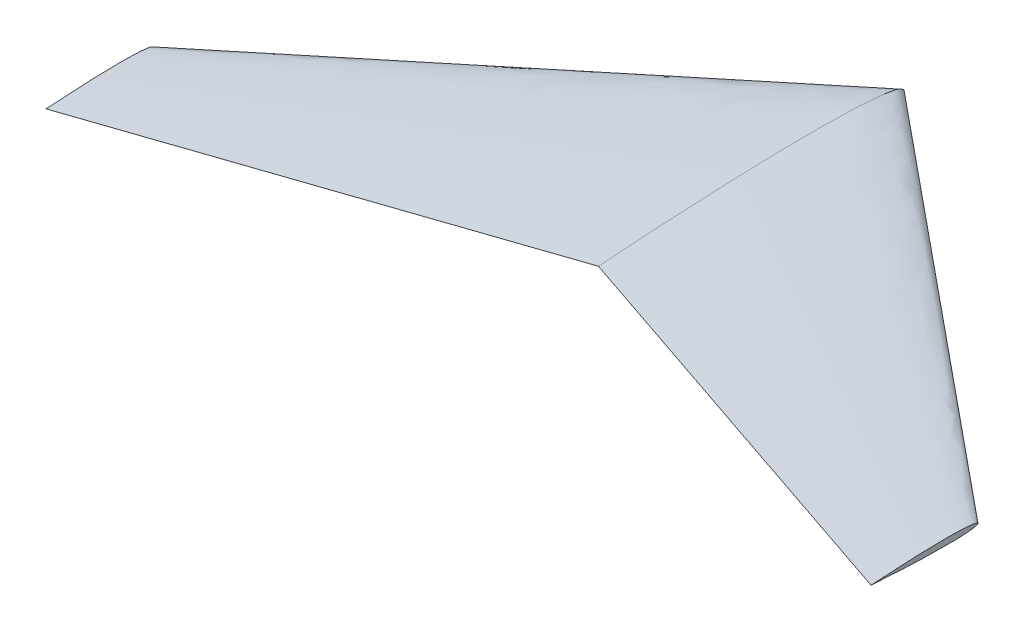
ISO-10303-21;
HEADER;
FILE_DESCRIPTION(('STEP AP214'),'2;1');
FILE_NAME('part.step','',(''),(''),'','','');
FILE_SCHEMA(('AUTOMOTIVE_DESIGN { 1 0 10303 214 1 1 1 1 }'));
ENDSEC;
DATA;
#1=APPLICATION_CONTEXT('core data for automotive mechanical design processes');
#2=APPLICATION_PROTOCOL_DEFINITION('international standard','automotive_design',2000,#1);
#3=PRODUCT_CONTEXT('',#1,'mechanical');
#4=PRODUCT('Part','Part','',(#3));
#5=PRODUCT_RELATED_PRODUCT_CATEGORY('part','',(#4));
#6=PRODUCT_DEFINITION_FORMATION('','',#4);
#7=PRODUCT_DEFINITION_CONTEXT('part definition',#1,'design');
#8=PRODUCT_DEFINITION('design','',#6,#7);
#9=PRODUCT_DEFINITION_SHAPE('','',#8);
#10=(LENGTH_UNIT() NAMED_UNIT(*) SI_UNIT(.MILLI.,.METRE.));
#11=(NAMED_UNIT(*) PLANE_ANGLE_UNIT() SI_UNIT($,.RADIAN.));
#12=(NAMED_UNIT(*) SI_UNIT($,.STERADIAN.) SOLID_ANGLE_UNIT());
#13=UNCERTAINTY_MEASURE_WITH_UNIT(LENGTH_MEASURE(1.E-05),#10,'distance_accuracy_value','');
#14=(GEOMETRIC_REPRESENTATION_CONTEXT(3) GLOBAL_UNCERTAINTY_ASSIGNED_CONTEXT((#13)) GLOBAL_UNIT_ASSIGNED_CONTEXT((#10,
#11,#12)) REPRESENTATION_CONTEXT('',''));
#15=CARTESIAN_POINT('',(0.,0.,0.));
#16=DIRECTION('',(0.,0.,1.));
#17=DIRECTION('',(1.,0.,0.));
#18=AXIS2_PLACEMENT_3D('',#15,#16,#17);
#19=CARTESIAN_POINT('',(1625.86494739886,10.9998878751663,1544.16619316165));
#20=DIRECTION('',(-1.,0.,0.));
#21=DIRECTION('',(0.,0.,-1.));
#22=AXIS2_PLACEMENT_3D('',#19,#20,#21);
#23=PLANE('',#22);
#24=CARTESIAN_POINT('',(1625.86494739886,2.99096590766585E-13,1755.66940008844));
#25=CARTESIAN_POINT('',(1625.86494739886,2.69379070355097,1713.55821259641));
#26=CARTESIAN_POINT('',(1625.86494739886,7.15490895316716,1643.34444697678));
#27=CARTESIAN_POINT('',(1625.86494739886,10.1600068621279,1573.04445502687));
#28=CARTESIAN_POINT('',(1625.86494739886,11.793441250259,1516.88694944968));
#29=CARTESIAN_POINT('',(1625.86494739886,12.2293595488427,1488.73846486477));
#30=CARTESIAN_POINT('',(1625.86494739886,12.4458586138999,1446.58583090881));
#31=CARTESIAN_POINT('',(1625.86494739886,12.4425785286425,1432.46145410095));
#32=CARTESIAN_POINT('',(1625.86494739886,11.805847336537,1411.84644547347));
#33=CARTESIAN_POINT('',(1625.86494739886,11.4713631660103,1404.46875556761));
#34=CARTESIAN_POINT('',(1625.86494739886,10.6967725260206,1390.38391310282));
#35=CARTESIAN_POINT('',(1625.86494739886,10.2053641898004,1382.86259750918));
#36=CARTESIAN_POINT('',(1625.86494739886,9.42459695502239,1372.91761931592));
#37=CARTESIAN_POINT('',(1625.86494739886,9.13613677196032,1369.52370535319));
#38=CARTESIAN_POINT('',(1625.86494739886,8.40654203367219,1362.95812542551));
#39=CARTESIAN_POINT('',(1625.86494739886,7.89981362158927,1359.31047991023));
#40=CARTESIAN_POINT('',(1625.86494739886,6.44457969249969,1348.16830064396));
#41=CARTESIAN_POINT('',(1625.86494739886,5.58714233533725,1340.04694044481));
#42=CARTESIAN_POINT('',(1625.86494739886,0.,1334.14885817022));
#43=B_SPLINE_CURVE_WITH_KNOTS('',3,(#24,#25,#26,#27,#28,#29,#30,#31,#32,#33,#34,#35,#36,#37,#38,
#39,#40,#41,#42),.UNSPECIFIED.,.F.,.F.,(4,1,1,1,1,1,1,1,1,1,1,1,1,1,1,1,4),(0.,
0.298931815970666,0.498152968932554,0.498299211220126,0.696834066796415,0.697522121171649,
0.796796462208503,0.796844070583475,0.843589068570304,0.849087559843308,0.896763932817384,
0.896989321780881,0.919683005075993,0.920855221312245,0.943853286653914,0.945874325951041,1.),.UNSPECIFIED.);
#44=CARTESIAN_POINT('',(1625.86494739886,0.,1334.14885817022));
#45=VERTEX_POINT('',#44);
#46=CARTESIAN_POINT('',(1625.86494739886,3.02230096837851E-13,1755.66940008844));
#47=VERTEX_POINT('',#46);
#48=EDGE_CURVE('E88',#45,#47,#43,.F.);
#49=ORIENTED_EDGE('',*,*,#48,.T.);
#50=CARTESIAN_POINT('',(1625.86494739886,0.,1334.14885817022));
#51=CARTESIAN_POINT('',(1625.86494739886,-5.58714233533639,1340.04694044481));
#52=CARTESIAN_POINT('',(1625.86494739886,-6.44457969249898,1348.16830064396));
#53=CARTESIAN_POINT('',(1625.86494739886,-7.8998136215886,1359.31047991023));
#54=CARTESIAN_POINT('',(1625.86494739886,-8.40654203367152,1362.95812542551));
#55=CARTESIAN_POINT('',(1625.86494739886,-9.13613677195964,1369.52370535319));
#56=CARTESIAN_POINT('',(1625.86494739886,-9.42459695502171,1372.91761931592));
#57=CARTESIAN_POINT('',(1625.86494739886,-10.2053641897997,1382.86259750918));
#58=CARTESIAN_POINT('',(1625.86494739886,-10.6967725260199,1390.38391310282));
#59=CARTESIAN_POINT('',(1625.86494739886,-11.4713631660097,1404.46875556761));
#60=CARTESIAN_POINT('',(1625.86494739886,-11.8058473365363,1411.84644547347));
#61=CARTESIAN_POINT('',(1625.86494739886,-12.4425785286418,1432.46145410095));
#62=CARTESIAN_POINT('',(1625.86494739886,-12.4458586138992,1446.58583090881));
#63=CARTESIAN_POINT('',(1625.86494739886,-12.229359548842,1488.73846486477));
#64=CARTESIAN_POINT('',(1625.86494739886,-11.7934412502583,1516.88694944968));
#65=CARTESIAN_POINT('',(1625.86494739886,-10.1600068621272,1573.04445502687));
#66=CARTESIAN_POINT('',(1625.86494739886,-7.15490895316653,1643.34444697678));
#67=CARTESIAN_POINT('',(1625.86494739886,-2.69379070355036,1713.55821259641));
#68=CARTESIAN_POINT('',(1625.86494739886,3.02230096837851E-13,1755.66940008844));
#69=B_SPLINE_CURVE_WITH_KNOTS('',3,(#50,#51,#52,#53,#54,#55,#56,#57,#58,#59,#60,#61,#62,#63,#64,
#65,#66,#67,#68),.UNSPECIFIED.,.F.,.F.,(4,1,1,1,1,1,1,1,1,1,1,1,1,1,1,1,4),(0.,
0.054125674048958,0.0561467133460857,0.0791447786877542,0.0803169949240068,0.103010678219119,
0.103236067182615,0.150912440156692,0.156410931429695,0.203155929416525,0.203203537791496,
0.302477878828351,0.303165933203584,0.501700788779874,0.501847031067446,0.701068184029334,1.),.UNSPECIFIED.);
#70=EDGE_CURVE('E119',#47,#45,#69,.F.);
#71=ORIENTED_EDGE('',*,*,#70,.T.);
#72=EDGE_LOOP('',(#49,#71));
#73=FACE_BOUND('',#72,.T.);
#74=ADVANCED_FACE('F85',(#73),#23,.F.);
#75=CARTESIAN_POINT('',(-1625.86494739886,10.9998878751663,1544.16619316165));
#76=DIRECTION('',(1.,0.,0.));
#77=DIRECTION('',(0.,0.,-1.));
#78=AXIS2_PLACEMENT_3D('',#75,#76,#77);
#79=PLANE('',#78);
#80=CARTESIAN_POINT('',(-1625.86494739886,2.99096590766585E-13,1755.66940008844));
#81=CARTESIAN_POINT('',(-1625.86494739886,2.69379070355097,1713.55821259641));
#82=CARTESIAN_POINT('',(-1625.86494739886,7.15490895316716,1643.34444697678));
#83=CARTESIAN_POINT('',(-1625.86494739886,10.1600068621279,1573.04445502687));
#84=CARTESIAN_POINT('',(-1625.86494739886,11.793441250259,1516.88694944968));
#85=CARTESIAN_POINT('',(-1625.86494739886,12.2293595488427,1488.73846486477));
#86=CARTESIAN_POINT('',(-1625.86494739886,12.4458586138999,1446.58583090881));
#87=CARTESIAN_POINT('',(-1625.86494739886,12.4425785286425,1432.46145410095));
#88=CARTESIAN_POINT('',(-1625.86494739886,11.805847336537,1411.84644547347));
#89=CARTESIAN_POINT('',(-1625.86494739886,11.4713631660103,1404.46875556761));
#90=CARTESIAN_POINT('',(-1625.86494739886,10.6967725260206,1390.38391310282));
#91=CARTESIAN_POINT('',(-1625.86494739886,10.2053641898004,1382.86259750918));
#92=CARTESIAN_POINT('',(-1625.86494739886,9.42459695502239,1372.91761931592));
#93=CARTESIAN_POINT('',(-1625.86494739886,9.13613677196032,1369.52370535319));
#94=CARTESIAN_POINT('',(-1625.86494739886,8.40654203367219,1362.95812542551));
#95=CARTESIAN_POINT('',(-1625.86494739886,7.89981362158927,1359.31047991023));
#96=CARTESIAN_POINT('',(-1625.86494739886,6.44457969249969,1348.16830064396));
#97=CARTESIAN_POINT('',(-1625.86494739886,5.58714233533725,1340.04694044481));
#98=CARTESIAN_POINT('',(-1625.86494739886,0.,1334.14885817022));
#99=B_SPLINE_CURVE_WITH_KNOTS('',3,(#80,#81,#82,#83,#84,#85,#86,#87,#88,#89,#90,#91,#92,#93,#94,
#95,#96,#97,#98),.UNSPECIFIED.,.F.,.F.,(4,1,1,1,1,1,1,1,1,1,1,1,1,1,1,1,4),(0.,
0.298931815970666,0.498152968932554,0.498299211220126,0.696834066796415,0.697522121171649,
0.796796462208503,0.796844070583475,0.843589068570304,0.849087559843308,0.896763932817384,
0.896989321780881,0.919683005075993,0.920855221312245,0.943853286653914,0.945874325951041,1.),.UNSPECIFIED.);
#100=CARTESIAN_POINT('',(-1625.86494739886,0.,1334.14885817022));
#101=VERTEX_POINT('',#100);
#102=CARTESIAN_POINT('',(-1625.86494739886,3.02230096837851E-13,1755.66940008844));
#103=VERTEX_POINT('',#102);
#104=EDGE_CURVE('E97',#101,#103,#99,.F.);
#105=ORIENTED_EDGE('',*,*,#104,.F.);
#106=CARTESIAN_POINT('',(-1625.86494739886,0.,1334.14885817022));
#107=CARTESIAN_POINT('',(-1625.86494739886,-5.58714233533639,1340.04694044481));
#108=CARTESIAN_POINT('',(-1625.86494739886,-6.44457969249898,1348.16830064396));
#109=CARTESIAN_POINT('',(-1625.86494739886,-7.8998136215886,1359.31047991023));
#110=CARTESIAN_POINT('',(-1625.86494739886,-8.40654203367152,1362.95812542551));
#111=CARTESIAN_POINT('',(-1625.86494739886,-9.13613677195964,1369.52370535319));
#112=CARTESIAN_POINT('',(-1625.86494739886,-9.42459695502171,1372.91761931592));
#113=CARTESIAN_POINT('',(-1625.86494739886,-10.2053641897997,1382.86259750918));
#114=CARTESIAN_POINT('',(-1625.86494739886,-10.6967725260199,1390.38391310282));
#115=CARTESIAN_POINT('',(-1625.86494739886,-11.4713631660097,1404.46875556761));
#116=CARTESIAN_POINT('',(-1625.86494739886,-11.8058473365363,1411.84644547347));
#117=CARTESIAN_POINT('',(-1625.86494739886,-12.4425785286418,1432.46145410095));
#118=CARTESIAN_POINT('',(-1625.86494739886,-12.4458586138992,1446.58583090881));
#119=CARTESIAN_POINT('',(-1625.86494739886,-12.229359548842,1488.73846486477));
#120=CARTESIAN_POINT('',(-1625.86494739886,-11.7934412502583,1516.88694944968));
#121=CARTESIAN_POINT('',(-1625.86494739886,-10.1600068621272,1573.04445502687));
#122=CARTESIAN_POINT('',(-1625.86494739886,-7.15490895316653,1643.34444697678));
#123=CARTESIAN_POINT('',(-1625.86494739886,-2.69379070355036,1713.55821259641));
#124=CARTESIAN_POINT('',(-1625.86494739886,3.02230096837851E-13,1755.66940008844));
#125=B_SPLINE_CURVE_WITH_KNOTS('',3,(#106,#107,#108,#109,#110,#111,#112,#113,#114,#115,#116,
#117,#118,#119,#120,#121,#122,#123,#124),.UNSPECIFIED.,.F.,.F.,(4,1,1,1,1,1,1,1,1,1,1,1,1,1,1,1,
4),(0.,0.054125674048958,0.0561467133460857,0.0791447786877542,0.0803169949240068,
0.103010678219119,0.103236067182615,0.150912440156692,0.156410931429695,0.203155929416525,
0.203203537791496,0.302477878828351,0.303165933203584,0.501700788779874,0.501847031067446,
0.701068184029334,1.),.UNSPECIFIED.);
#126=EDGE_CURVE('E157',#103,#101,#125,.F.);
#127=ORIENTED_EDGE('',*,*,#126,.F.);
#128=EDGE_LOOP('',(#105,#127));
#129=FACE_BOUND('',#128,.T.);
#130=ADVANCED_FACE('F211',(#129),#79,.F.);
#131=CARTESIAN_POINT('',(0.,-1.51223721467539E-13,1204.34440548063));
#132=CARTESIAN_POINT('',(1625.86494739886,2.99096590766585E-13,1755.66940008844));
#133=CARTESIAN_POINT('',(0.,9.27380237053897,1084.08940754912));
#134=CARTESIAN_POINT('',(1625.86494739886,2.69379070355097,1713.55821259641));
#135=CARTESIAN_POINT('',(0.,21.2542710086637,883.42796730396));
#136=CARTESIAN_POINT('',(1625.86494739886,7.15490895316716,1643.34444697678));
#137=CARTESIAN_POINT('',(0.,29.779640774057,682.566932773487));
#138=CARTESIAN_POINT('',(1625.86494739886,10.1600068621279,1573.04445502687));
#139=CARTESIAN_POINT('',(0.,34.987531488122,522.08746686468));
#140=CARTESIAN_POINT('',(1625.86494739886,11.793441250259,1516.88694944968));
#141=CARTESIAN_POINT('',(0.,36.7979486113621,441.635298602372));
#142=CARTESIAN_POINT('',(1625.86494739886,12.2293595488427,1488.73846486477));
#143=CARTESIAN_POINT('',(0.,36.2269478552587,321.219313431693));
#144=CARTESIAN_POINT('',(1625.86494739886,12.4458586138999,1446.58583090881));
#145=CARTESIAN_POINT('',(0.,35.4827497958292,280.880942596431));
#146=CARTESIAN_POINT('',(1625.86494739886,12.4425785286425,1432.46145410095));
#147=CARTESIAN_POINT('',(0.,34.4502958223761,221.933933103048));
#148=CARTESIAN_POINT('',(1625.86494739886,11.805847336537,1411.84644547347));
#149=CARTESIAN_POINT('',(0.,34.0899386682203,200.82587507705));
#150=CARTESIAN_POINT('',(1625.86494739886,11.4713631660103,1404.46875556761));
#151=CARTESIAN_POINT('',(0.,31.9058246415428,160.58657217448));
#152=CARTESIAN_POINT('',(1625.86494739886,10.6967725260206,1390.38391310282));
#153=CARTESIAN_POINT('',(0.,29.8281069455911,139.139813073193));
#154=CARTESIAN_POINT('',(1625.86494739886,10.2053641898004,1382.86259750918));
#155=CARTESIAN_POINT('',(0.,27.8306367987286,110.70513249348));
#156=CARTESIAN_POINT('',(1625.86494739886,9.42459695502239,1372.91761931592));
#157=CARTESIAN_POINT('',(0.,27.272740708991,100.988062976942));
#158=CARTESIAN_POINT('',(1625.86494739886,9.13613677196032,1369.52370535319));
#159=CARTESIAN_POINT('',(0.,25.2300871640852,82.2191837169622));
#160=CARTESIAN_POINT('',(1625.86494739886,8.40654203367219,1362.95812542551));
#161=CARTESIAN_POINT('',(0.,23.5773431350046,71.797805456231));
#162=CARTESIAN_POINT('',(1625.86494739886,7.89981362158927,1359.31047991023));
#163=CARTESIAN_POINT('',(0.,18.8711845076104,40.0693028198528));
#164=CARTESIAN_POINT('',(1625.86494739886,6.44457969249969,1348.16830064396));
#165=CARTESIAN_POINT('',(0.,15.5001871301405,17.3711240479235));
#166=CARTESIAN_POINT('',(1625.86494739886,5.58714233533725,1340.04694044481));
#167=CARTESIAN_POINT('',(0.,0.,0.));
#168=CARTESIAN_POINT('',(1625.86494739886,0.,1334.14885817022));
#169=B_SPLINE_SURFACE_WITH_KNOTS('',3,1,((#131,#132),(#133,#134),(#135,#136),(#137,#138),(#139,
#140),(#141,#142),(#143,#144),(#145,#146),(#147,#148),(#149,#150),(#151,#152),(#153,#154),(#155,
#156),(#157,#158),(#159,#160),(#161,#162),(#163,#164),(#165,#166),(#167,#168)),.UNSPECIFIED.,
.F.,.F.,.F.,(4,1,1,1,1,1,1,1,1,1,1,1,1,1,1,1,4),(2,2),(0.,0.298931815970666,0.498152968932554,
0.498299211220126,0.696834066796415,0.697522121171649,0.796796462208503,0.796844070583475,
0.843589068570304,0.849087559843308,0.896763932817384,0.896989321780881,0.919683005075993,
0.920855221312245,0.943853286653914,0.945874325951041,1.),(0.,1.),.UNSPECIFIED.);
#170=CARTESIAN_POINT('',(0.,-1.51223721467539E-13,1204.34440548063));
#171=CARTESIAN_POINT('',(0.,9.27380237053897,1084.08940754912));
#172=CARTESIAN_POINT('',(0.,21.2542710086637,883.42796730396));
#173=CARTESIAN_POINT('',(0.,29.779640774057,682.566932773487));
#174=CARTESIAN_POINT('',(0.,34.987531488122,522.08746686468));
#175=CARTESIAN_POINT('',(0.,36.7979486113621,441.635298602372));
#176=CARTESIAN_POINT('',(0.,36.2269478552587,321.219313431693));
#177=CARTESIAN_POINT('',(0.,35.4827497958292,280.880942596431));
#178=CARTESIAN_POINT('',(0.,34.4502958223761,221.933933103048));
#179=CARTESIAN_POINT('',(0.,34.0899386682203,200.82587507705));
#180=CARTESIAN_POINT('',(0.,31.9058246415428,160.58657217448));
#181=CARTESIAN_POINT('',(0.,29.8281069455911,139.139813073193));
#182=CARTESIAN_POINT('',(0.,27.8306367987286,110.70513249348));
#183=CARTESIAN_POINT('',(0.,27.272740708991,100.988062976942));
#184=CARTESIAN_POINT('',(0.,25.2300871640852,82.2191837169622));
#185=CARTESIAN_POINT('',(0.,23.5773431350046,71.797805456231));
#186=CARTESIAN_POINT('',(0.,18.8711845076104,40.0693028198528));
#187=CARTESIAN_POINT('',(0.,15.5001871301405,17.3711240479235));
#188=CARTESIAN_POINT('',(0.,0.,0.));
#189=B_SPLINE_CURVE_WITH_KNOTS('',3,(#170,#171,#172,#173,#174,#175,#176,#177,#178,#179,#180,
#181,#182,#183,#184,#185,#186,#187,#188),.UNSPECIFIED.,.F.,.F.,(4,1,1,1,1,1,1,1,1,1,1,1,1,1,1,1,
4),(0.,0.298931815970666,0.498152968932554,0.498299211220126,0.696834066796415,
0.697522121171649,0.796796462208503,0.796844070583475,0.843589068570304,0.849087559843308,
0.896763932817384,0.896989321780881,0.919683005075993,0.920855221312245,0.943853286653914,
0.945874325951041,1.),.UNSPECIFIED.);
#190=CARTESIAN_POINT('',(0.,-1.43755582781038E-13,1204.34440548063));
#191=VERTEX_POINT('',#190);
#192=CARTESIAN_POINT('',(0.,0.,0.));
#193=VERTEX_POINT('',#192);
#194=EDGE_CURVE('E48',#191,#193,#189,.T.);
#195=DIRECTION('',(0.947033228842652,0.,0.321135584244195));
#196=VECTOR('',#195,1.);
#197=CARTESIAN_POINT('',(812.932473699428,0.,1480.00690278454));
#198=LINE('',#197,#196);
#199=EDGE_CURVE('E124',#191,#47,#198,.T.);
#200=DIRECTION('',(-0.773048696155329,0.,-0.634346682321699));
#201=VECTOR('',#200,1.);
#202=CARTESIAN_POINT('',(812.932473699428,0.,667.07442908511));
#203=LINE('',#202,#201);
#204=EDGE_CURVE('E125',#45,#193,#203,.T.);
#205=ORIENTED_EDGE('',*,*,#194,.F.);
#206=ORIENTED_EDGE('',*,*,#199,.T.);
#207=ORIENTED_EDGE('',*,*,#48,.F.);
#208=ORIENTED_EDGE('',*,*,#204,.T.);
#209=EDGE_LOOP('',(#205,#206,#207,#208));
#210=FACE_BOUND('',#209,.T.);
#211=ADVANCED_FACE('F130',(#210),#169,.F.);
#212=CARTESIAN_POINT('',(0.,0.,0.));
#213=CARTESIAN_POINT('',(1625.86494739886,0.,1334.14885817022));
#214=CARTESIAN_POINT('',(0.,-15.5001871301402,17.3711240479232));
#215=CARTESIAN_POINT('',(1625.86494739886,-5.58714233533639,1340.04694044481));
#216=CARTESIAN_POINT('',(0.,-18.8711845076104,40.0693028198525));
#217=CARTESIAN_POINT('',(1625.86494739886,-6.44457969249898,1348.16830064396));
#218=CARTESIAN_POINT('',(0.,-23.5773431350046,71.7978054562304));
#219=CARTESIAN_POINT('',(1625.86494739886,-7.8998136215886,1359.31047991023));
#220=CARTESIAN_POINT('',(0.,-25.2300871640852,82.219183716962));
#221=CARTESIAN_POINT('',(1625.86494739886,-8.40654203367152,1362.95812542551));
#222=CARTESIAN_POINT('',(0.,-27.272740708991,100.988062976942));
#223=CARTESIAN_POINT('',(1625.86494739886,-9.13613677195964,1369.52370535319));
#224=CARTESIAN_POINT('',(0.,-27.8306367987286,110.70513249348));
#225=CARTESIAN_POINT('',(1625.86494739886,-9.42459695502171,1372.91761931592));
#226=CARTESIAN_POINT('',(0.,-29.8281069455911,139.139813073193));
#227=CARTESIAN_POINT('',(1625.86494739886,-10.2053641897997,1382.86259750918));
#228=CARTESIAN_POINT('',(0.,-31.9058246415427,160.58657217448));
#229=CARTESIAN_POINT('',(1625.86494739886,-10.6967725260199,1390.38391310282));
#230=CARTESIAN_POINT('',(0.,-34.0899386682204,200.825875077049));
#231=CARTESIAN_POINT('',(1625.86494739886,-11.4713631660097,1404.46875556761));
#232=CARTESIAN_POINT('',(0.,-34.4502958223762,221.933933103047));
#233=CARTESIAN_POINT('',(1625.86494739886,-11.8058473365363,1411.84644547347));
#234=CARTESIAN_POINT('',(0.,-35.4827497958292,280.880942596431));
#235=CARTESIAN_POINT('',(1625.86494739886,-12.4425785286418,1432.46145410095));
#236=CARTESIAN_POINT('',(0.,-36.2269478552588,321.219313431692));
#237=CARTESIAN_POINT('',(1625.86494739886,-12.4458586138992,1446.58583090881));
#238=CARTESIAN_POINT('',(0.,-36.7979486113622,441.635298602372));
#239=CARTESIAN_POINT('',(1625.86494739886,-12.229359548842,1488.73846486477));
#240=CARTESIAN_POINT('',(0.,-34.9875314881222,522.08746686468));
#241=CARTESIAN_POINT('',(1625.86494739886,-11.7934412502583,1516.88694944968));
#242=CARTESIAN_POINT('',(0.,-29.7796407740572,682.566932773486));
#243=CARTESIAN_POINT('',(1625.86494739886,-10.1600068621272,1573.04445502687));
#244=CARTESIAN_POINT('',(0.,-21.2542710086639,883.42796730396));
#245=CARTESIAN_POINT('',(1625.86494739886,-7.15490895316653,1643.34444697678));
#246=CARTESIAN_POINT('',(0.,-9.27380237053924,1084.08940754912));
#247=CARTESIAN_POINT('',(1625.86494739886,-2.69379070355036,1713.55821259641));
#248=CARTESIAN_POINT('',(0.,-1.43755582781038E-13,1204.34440548063));
#249=CARTESIAN_POINT('',(1625.86494739886,3.02230096837851E-13,1755.66940008844));
#250=B_SPLINE_SURFACE_WITH_KNOTS('',3,1,((#212,#213),(#214,#215),(#216,#217),(#218,#219),(#220,
#221),(#222,#223),(#224,#225),(#226,#227),(#228,#229),(#230,#231),(#232,#233),(#234,#235),(#236,
#237),(#238,#239),(#240,#241),(#242,#243),(#244,#245),(#246,#247),(#248,#249)),.UNSPECIFIED.,
.F.,.F.,.F.,(4,1,1,1,1,1,1,1,1,1,1,1,1,1,1,1,4),(2,2),(0.,0.054125674048958,0.0561467133460857,
0.0791447786877542,0.0803169949240068,0.103010678219119,0.103236067182615,0.150912440156692,
0.156410931429695,0.203155929416525,0.203203537791496,0.302477878828351,0.303165933203584,
0.501700788779874,0.501847031067446,0.701068184029334,1.),(0.,1.),.UNSPECIFIED.);
#251=CARTESIAN_POINT('',(0.,0.,0.));
#252=CARTESIAN_POINT('',(0.,-15.5001871301402,17.3711240479232));
#253=CARTESIAN_POINT('',(0.,-18.8711845076104,40.0693028198525));
#254=CARTESIAN_POINT('',(0.,-23.5773431350046,71.7978054562304));
#255=CARTESIAN_POINT('',(0.,-25.2300871640852,82.219183716962));
#256=CARTESIAN_POINT('',(0.,-27.272740708991,100.988062976942));
#257=CARTESIAN_POINT('',(0.,-27.8306367987286,110.70513249348));
#258=CARTESIAN_POINT('',(0.,-29.8281069455911,139.139813073193));
#259=CARTESIAN_POINT('',(0.,-31.9058246415427,160.58657217448));
#260=CARTESIAN_POINT('',(0.,-34.0899386682204,200.825875077049));
#261=CARTESIAN_POINT('',(0.,-34.4502958223762,221.933933103047));
#262=CARTESIAN_POINT('',(0.,-35.4827497958292,280.880942596431));
#263=CARTESIAN_POINT('',(0.,-36.2269478552588,321.219313431692));
#264=CARTESIAN_POINT('',(0.,-36.7979486113622,441.635298602372));
#265=CARTESIAN_POINT('',(0.,-34.9875314881222,522.08746686468));
#266=CARTESIAN_POINT('',(0.,-29.7796407740572,682.566932773486));
#267=CARTESIAN_POINT('',(0.,-21.2542710086639,883.42796730396));
#268=CARTESIAN_POINT('',(0.,-9.27380237053924,1084.08940754912));
#269=CARTESIAN_POINT('',(0.,-1.43755582781038E-13,1204.34440548063));
#270=B_SPLINE_CURVE_WITH_KNOTS('',3,(#251,#252,#253,#254,#255,#256,#257,#258,#259,#260,#261,
#262,#263,#264,#265,#266,#267,#268,#269),.UNSPECIFIED.,.F.,.F.,(4,1,1,1,1,1,1,1,1,1,1,1,1,1,1,1,
4),(0.,0.054125674048958,0.0561467133460857,0.0791447786877542,0.0803169949240068,
0.103010678219119,0.103236067182615,0.150912440156692,0.156410931429695,0.203155929416525,
0.203203537791496,0.302477878828351,0.303165933203584,0.501700788779874,0.501847031067446,
0.701068184029334,1.),.UNSPECIFIED.);
#271=EDGE_CURVE('E135',#193,#191,#270,.T.);
#272=ORIENTED_EDGE('',*,*,#271,.F.);
#273=ORIENTED_EDGE('',*,*,#204,.F.);
#274=ORIENTED_EDGE('',*,*,#70,.F.);
#275=ORIENTED_EDGE('',*,*,#199,.F.);
#276=EDGE_LOOP('',(#272,#273,#274,#275));
#277=FACE_BOUND('',#276,.T.);
#278=ADVANCED_FACE('F133',(#277),#250,.F.);
#279=CARTESIAN_POINT('',(0.,-1.51223721467539E-13,1204.34440548063));
#280=CARTESIAN_POINT('',(-1625.86494739886,2.99096590766585E-13,1755.66940008844));
#281=CARTESIAN_POINT('',(0.,9.27380237053897,1084.08940754912));
#282=CARTESIAN_POINT('',(-1625.86494739886,2.69379070355097,1713.55821259641));
#283=CARTESIAN_POINT('',(0.,21.2542710086637,883.42796730396));
#284=CARTESIAN_POINT('',(-1625.86494739886,7.15490895316716,1643.34444697678));
#285=CARTESIAN_POINT('',(0.,29.779640774057,682.566932773487));
#286=CARTESIAN_POINT('',(-1625.86494739886,10.1600068621279,1573.04445502687));
#287=CARTESIAN_POINT('',(0.,34.987531488122,522.08746686468));
#288=CARTESIAN_POINT('',(-1625.86494739886,11.793441250259,1516.88694944968));
#289=CARTESIAN_POINT('',(0.,36.7979486113621,441.635298602372));
#290=CARTESIAN_POINT('',(-1625.86494739886,12.2293595488427,1488.73846486477));
#291=CARTESIAN_POINT('',(0.,36.2269478552587,321.219313431693));
#292=CARTESIAN_POINT('',(-1625.86494739886,12.4458586138999,1446.58583090881));
#293=CARTESIAN_POINT('',(0.,35.4827497958292,280.880942596431));
#294=CARTESIAN_POINT('',(-1625.86494739886,12.4425785286425,1432.46145410095));
#295=CARTESIAN_POINT('',(0.,34.4502958223761,221.933933103048));
#296=CARTESIAN_POINT('',(-1625.86494739886,11.805847336537,1411.84644547347));
#297=CARTESIAN_POINT('',(0.,34.0899386682203,200.82587507705));
#298=CARTESIAN_POINT('',(-1625.86494739886,11.4713631660103,1404.46875556761));
#299=CARTESIAN_POINT('',(0.,31.9058246415428,160.58657217448));
#300=CARTESIAN_POINT('',(-1625.86494739886,10.6967725260206,1390.38391310282));
#301=CARTESIAN_POINT('',(0.,29.8281069455911,139.139813073193));
#302=CARTESIAN_POINT('',(-1625.86494739886,10.2053641898004,1382.86259750918));
#303=CARTESIAN_POINT('',(0.,27.8306367987286,110.70513249348));
#304=CARTESIAN_POINT('',(-1625.86494739886,9.42459695502239,1372.91761931592));
#305=CARTESIAN_POINT('',(0.,27.272740708991,100.988062976942));
#306=CARTESIAN_POINT('',(-1625.86494739886,9.13613677196032,1369.52370535319));
#307=CARTESIAN_POINT('',(0.,25.2300871640852,82.2191837169622));
#308=CARTESIAN_POINT('',(-1625.86494739886,8.40654203367219,1362.95812542551));
#309=CARTESIAN_POINT('',(0.,23.5773431350046,71.797805456231));
#310=CARTESIAN_POINT('',(-1625.86494739886,7.89981362158927,1359.31047991023));
#311=CARTESIAN_POINT('',(0.,18.8711845076104,40.0693028198528));
#312=CARTESIAN_POINT('',(-1625.86494739886,6.44457969249969,1348.16830064396));
#313=CARTESIAN_POINT('',(0.,15.5001871301405,17.3711240479235));
#314=CARTESIAN_POINT('',(-1625.86494739886,5.58714233533725,1340.04694044481));
#315=CARTESIAN_POINT('',(0.,0.,0.));
#316=CARTESIAN_POINT('',(-1625.86494739886,0.,1334.14885817022));
#317=B_SPLINE_SURFACE_WITH_KNOTS('',3,1,((#279,#280),(#281,#282),(#283,#284),(#285,#286),(#287,
#288),(#289,#290),(#291,#292),(#293,#294),(#295,#296),(#297,#298),(#299,#300),(#301,#302),(#303,
#304),(#305,#306),(#307,#308),(#309,#310),(#311,#312),(#313,#314),(#315,#316)),.UNSPECIFIED.,
.F.,.F.,.F.,(4,1,1,1,1,1,1,1,1,1,1,1,1,1,1,1,4),(2,2),(0.,0.298931815970666,0.498152968932554,
0.498299211220126,0.696834066796415,0.697522121171649,0.796796462208503,0.796844070583475,
0.843589068570304,0.849087559843308,0.896763932817384,0.896989321780881,0.919683005075993,
0.920855221312245,0.943853286653914,0.945874325951041,1.),(0.,1.),.UNSPECIFIED.);
#318=DIRECTION('',(0.773048696155329,0.,-0.634346682321699));
#319=VECTOR('',#318,1.);
#320=CARTESIAN_POINT('',(-812.932473699428,0.,667.07442908511));
#321=LINE('',#320,#319);
#322=EDGE_CURVE('E132',#101,#193,#321,.T.);
#323=DIRECTION('',(-0.947033228842652,0.,0.321135584244195));
#324=VECTOR('',#323,1.);
#325=CARTESIAN_POINT('',(-812.932473699428,0.,1480.00690278454));
#326=LINE('',#325,#324);
#327=EDGE_CURVE('E158',#191,#103,#326,.T.);
#328=ORIENTED_EDGE('',*,*,#194,.T.);
#329=ORIENTED_EDGE('',*,*,#322,.F.);
#330=ORIENTED_EDGE('',*,*,#104,.T.);
#331=ORIENTED_EDGE('',*,*,#327,.F.);
#332=EDGE_LOOP('',(#328,#329,#330,#331));
#333=FACE_BOUND('',#332,.T.);
#334=ADVANCED_FACE('F182',(#333),#317,.T.);
#335=CARTESIAN_POINT('',(0.,0.,0.));
#336=CARTESIAN_POINT('',(-1625.86494739886,0.,1334.14885817022));
#337=CARTESIAN_POINT('',(0.,-15.5001871301402,17.3711240479232));
#338=CARTESIAN_POINT('',(-1625.86494739886,-5.58714233533639,1340.04694044481));
#339=CARTESIAN_POINT('',(0.,-18.8711845076104,40.0693028198525));
#340=CARTESIAN_POINT('',(-1625.86494739886,-6.44457969249898,1348.16830064396));
#341=CARTESIAN_POINT('',(0.,-23.5773431350046,71.7978054562304));
#342=CARTESIAN_POINT('',(-1625.86494739886,-7.8998136215886,1359.31047991023));
#343=CARTESIAN_POINT('',(0.,-25.2300871640852,82.219183716962));
#344=CARTESIAN_POINT('',(-1625.86494739886,-8.40654203367152,1362.95812542551));
#345=CARTESIAN_POINT('',(0.,-27.272740708991,100.988062976942));
#346=CARTESIAN_POINT('',(-1625.86494739886,-9.13613677195964,1369.52370535319));
#347=CARTESIAN_POINT('',(0.,-27.8306367987286,110.70513249348));
#348=CARTESIAN_POINT('',(-1625.86494739886,-9.42459695502171,1372.91761931592));
#349=CARTESIAN_POINT('',(0.,-29.8281069455911,139.139813073193));
#350=CARTESIAN_POINT('',(-1625.86494739886,-10.2053641897997,1382.86259750918));
#351=CARTESIAN_POINT('',(0.,-31.9058246415427,160.58657217448));
#352=CARTESIAN_POINT('',(-1625.86494739886,-10.6967725260199,1390.38391310282));
#353=CARTESIAN_POINT('',(0.,-34.0899386682204,200.825875077049));
#354=CARTESIAN_POINT('',(-1625.86494739886,-11.4713631660097,1404.46875556761));
#355=CARTESIAN_POINT('',(0.,-34.4502958223762,221.933933103047));
#356=CARTESIAN_POINT('',(-1625.86494739886,-11.8058473365363,1411.84644547347));
#357=CARTESIAN_POINT('',(0.,-35.4827497958292,280.880942596431));
#358=CARTESIAN_POINT('',(-1625.86494739886,-12.4425785286418,1432.46145410095));
#359=CARTESIAN_POINT('',(0.,-36.2269478552588,321.219313431692));
#360=CARTESIAN_POINT('',(-1625.86494739886,-12.4458586138992,1446.58583090881));
#361=CARTESIAN_POINT('',(0.,-36.7979486113622,441.635298602372));
#362=CARTESIAN_POINT('',(-1625.86494739886,-12.229359548842,1488.73846486477));
#363=CARTESIAN_POINT('',(0.,-34.9875314881222,522.08746686468));
#364=CARTESIAN_POINT('',(-1625.86494739886,-11.7934412502583,1516.88694944968));
#365=CARTESIAN_POINT('',(0.,-29.7796407740572,682.566932773486));
#366=CARTESIAN_POINT('',(-1625.86494739886,-10.1600068621272,1573.04445502687));
#367=CARTESIAN_POINT('',(0.,-21.2542710086639,883.42796730396));
#368=CARTESIAN_POINT('',(-1625.86494739886,-7.15490895316653,1643.34444697678));
#369=CARTESIAN_POINT('',(0.,-9.27380237053924,1084.08940754912));
#370=CARTESIAN_POINT('',(-1625.86494739886,-2.69379070355036,1713.55821259641));
#371=CARTESIAN_POINT('',(0.,-1.43755582781038E-13,1204.34440548063));
#372=CARTESIAN_POINT('',(-1625.86494739886,3.02230096837851E-13,1755.66940008844));
#373=B_SPLINE_SURFACE_WITH_KNOTS('',3,1,((#335,#336),(#337,#338),(#339,#340),(#341,#342),(#343,
#344),(#345,#346),(#347,#348),(#349,#350),(#351,#352),(#353,#354),(#355,#356),(#357,#358),(#359,
#360),(#361,#362),(#363,#364),(#365,#366),(#367,#368),(#369,#370),(#371,#372)),.UNSPECIFIED.,
.F.,.F.,.F.,(4,1,1,1,1,1,1,1,1,1,1,1,1,1,1,1,4),(2,2),(0.,0.054125674048958,0.0561467133460857,
0.0791447786877542,0.0803169949240068,0.103010678219119,0.103236067182615,0.150912440156692,
0.156410931429695,0.203155929416525,0.203203537791496,0.302477878828351,0.303165933203584,
0.501700788779874,0.501847031067446,0.701068184029334,1.),(0.,1.),.UNSPECIFIED.);
#374=ORIENTED_EDGE('',*,*,#271,.T.);
#375=ORIENTED_EDGE('',*,*,#327,.T.);
#376=ORIENTED_EDGE('',*,*,#126,.T.);
#377=ORIENTED_EDGE('',*,*,#322,.T.);
#378=EDGE_LOOP('',(#374,#375,#376,#377));
#379=FACE_BOUND('',#378,.T.);
#380=ADVANCED_FACE('F179',(#379),#373,.T.);
#381=CLOSED_SHELL('',(#74,#130,#211,#278,#334,#380));
#382=MANIFOLD_SOLID_BREP('B6',#381);
#383=ADVANCED_BREP_SHAPE_REPRESENTATION('',(#18,#382),#14);
#384=SHAPE_DEFINITION_REPRESENTATION(#9,#383);
ENDSEC;
END-ISO-10303-21;
